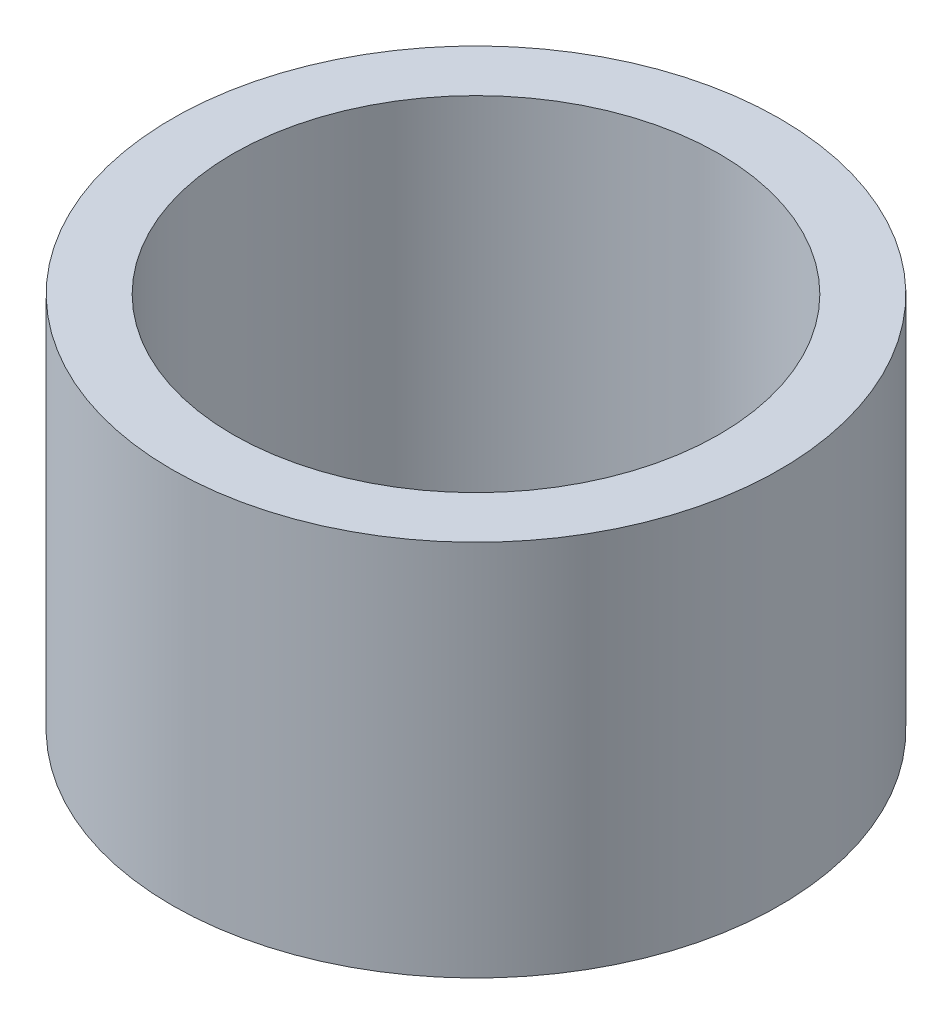
ISO-10303-21;
HEADER;
FILE_DESCRIPTION(('STEP AP214'),'2;1');
FILE_NAME('part.step','',(''),(''),'','','');
FILE_SCHEMA(('AUTOMOTIVE_DESIGN { 1 0 10303 214 1 1 1 1 }'));
ENDSEC;
DATA;
#1=APPLICATION_CONTEXT('core data for automotive mechanical design processes');
#2=APPLICATION_PROTOCOL_DEFINITION('international standard','automotive_design',2000,#1);
#3=PRODUCT_CONTEXT('',#1,'mechanical');
#4=PRODUCT('Part','Part','',(#3));
#5=PRODUCT_RELATED_PRODUCT_CATEGORY('part','',(#4));
#6=PRODUCT_DEFINITION_FORMATION('','',#4);
#7=PRODUCT_DEFINITION_CONTEXT('part definition',#1,'design');
#8=PRODUCT_DEFINITION('design','',#6,#7);
#9=PRODUCT_DEFINITION_SHAPE('','',#8);
#10=(LENGTH_UNIT() NAMED_UNIT(*) SI_UNIT(.MILLI.,.METRE.));
#11=(NAMED_UNIT(*) PLANE_ANGLE_UNIT() SI_UNIT($,.RADIAN.));
#12=(NAMED_UNIT(*) SI_UNIT($,.STERADIAN.) SOLID_ANGLE_UNIT());
#13=UNCERTAINTY_MEASURE_WITH_UNIT(LENGTH_MEASURE(1.E-05),#10,'distance_accuracy_value','');
#14=(GEOMETRIC_REPRESENTATION_CONTEXT(3) GLOBAL_UNCERTAINTY_ASSIGNED_CONTEXT((#13)) GLOBAL_UNIT_ASSIGNED_CONTEXT((#10,
#11,#12)) REPRESENTATION_CONTEXT('',''));
#15=CARTESIAN_POINT('',(0.,0.,0.));
#16=DIRECTION('',(0.,0.,1.));
#17=DIRECTION('',(1.,0.,0.));
#18=AXIS2_PLACEMENT_3D('',#15,#16,#17);
#19=CARTESIAN_POINT('',(0.,19.7104,0.));
#20=DIRECTION('',(0.,1.,0.));
#21=DIRECTION('',(0.,0.,1.));
#22=AXIS2_PLACEMENT_3D('',#19,#20,#21);
#23=PLANE('',#22);
#24=CARTESIAN_POINT('',(0.,19.7104,0.));
#25=DIRECTION('',(0.,1.,0.));
#26=DIRECTION('',(0.,0.,1.));
#27=AXIS2_PLACEMENT_3D('',#24,#25,#26);
#28=CIRCLE('',#27,31.75);
#29=CARTESIAN_POINT('',(0.,19.7104,31.75));
#30=VERTEX_POINT('',#29);
#31=EDGE_CURVE('E10',#30,#30,#28,.T.);
#32=ORIENTED_EDGE('',*,*,#31,.T.);
#33=EDGE_LOOP('',(#32));
#34=FACE_BOUND('',#33,.T.);
#35=CARTESIAN_POINT('',(0.,19.7104,0.));
#36=DIRECTION('',(0.,1.,0.));
#37=DIRECTION('',(0.,0.,1.));
#38=AXIS2_PLACEMENT_3D('',#35,#36,#37);
#39=CIRCLE('',#38,25.4);
#40=CARTESIAN_POINT('',(0.,19.7104,25.4));
#41=VERTEX_POINT('',#40);
#42=EDGE_CURVE('E42',#41,#41,#39,.T.);
#43=ORIENTED_EDGE('',*,*,#42,.F.);
#44=EDGE_LOOP('',(#43));
#45=FACE_BOUND('',#44,.T.);
#46=ADVANCED_FACE('F31',(#34,#45),#23,.T.);
#47=CARTESIAN_POINT('',(0.,-19.7104,0.));
#48=DIRECTION('',(0.,1.,0.));
#49=DIRECTION('',(0.,0.,1.));
#50=AXIS2_PLACEMENT_3D('',#47,#48,#49);
#51=PLANE('',#50);
#52=CARTESIAN_POINT('',(0.,-19.7104,0.));
#53=DIRECTION('',(0.,1.,0.));
#54=DIRECTION('',(0.,0.,1.));
#55=AXIS2_PLACEMENT_3D('',#52,#53,#54);
#56=CIRCLE('',#55,31.75);
#57=CARTESIAN_POINT('',(0.,-19.7104,31.75));
#58=VERTEX_POINT('',#57);
#59=EDGE_CURVE('E35',#58,#58,#56,.T.);
#60=ORIENTED_EDGE('',*,*,#59,.F.);
#61=EDGE_LOOP('',(#60));
#62=FACE_BOUND('',#61,.T.);
#63=CARTESIAN_POINT('',(0.,-19.7104,0.));
#64=DIRECTION('',(0.,1.,0.));
#65=DIRECTION('',(0.,0.,1.));
#66=AXIS2_PLACEMENT_3D('',#63,#64,#65);
#67=CIRCLE('',#66,25.4);
#68=CARTESIAN_POINT('',(0.,-19.7104,25.4));
#69=VERTEX_POINT('',#68);
#70=EDGE_CURVE('E44',#69,#69,#67,.T.);
#71=ORIENTED_EDGE('',*,*,#70,.T.);
#72=EDGE_LOOP('',(#71));
#73=FACE_BOUND('',#72,.T.);
#74=ADVANCED_FACE('F54',(#62,#73),#51,.F.);
#75=CARTESIAN_POINT('',(0.,19.7104,0.));
#76=DIRECTION('',(0.,-1.,0.));
#77=DIRECTION('',(0.,0.,-1.));
#78=AXIS2_PLACEMENT_3D('',#75,#76,#77);
#79=CYLINDRICAL_SURFACE('',#78,31.75);
#80=ORIENTED_EDGE('',*,*,#31,.F.);
#81=EDGE_LOOP('',(#80));
#82=FACE_BOUND('',#81,.T.);
#83=ORIENTED_EDGE('',*,*,#59,.T.);
#84=EDGE_LOOP('',(#83));
#85=FACE_BOUND('',#84,.T.);
#86=ADVANCED_FACE('F33',(#82,#85),#79,.T.);
#87=CARTESIAN_POINT('',(0.,19.7104,0.));
#88=DIRECTION('',(0.,-1.,0.));
#89=DIRECTION('',(0.,0.,-1.));
#90=AXIS2_PLACEMENT_3D('',#87,#88,#89);
#91=CYLINDRICAL_SURFACE('',#90,25.4);
#92=ORIENTED_EDGE('',*,*,#42,.T.);
#93=EDGE_LOOP('',(#92));
#94=FACE_BOUND('',#93,.T.);
#95=ORIENTED_EDGE('',*,*,#70,.F.);
#96=EDGE_LOOP('',(#95));
#97=FACE_BOUND('',#96,.T.);
#98=ADVANCED_FACE('F50',(#94,#97),#91,.F.);
#99=CLOSED_SHELL('',(#46,#74,#86,#98));
#100=MANIFOLD_SOLID_BREP('B2',#99);
#101=ADVANCED_BREP_SHAPE_REPRESENTATION('',(#18,#100),#14);
#102=SHAPE_DEFINITION_REPRESENTATION(#9,#101);
ENDSEC;
END-ISO-10303-21;
